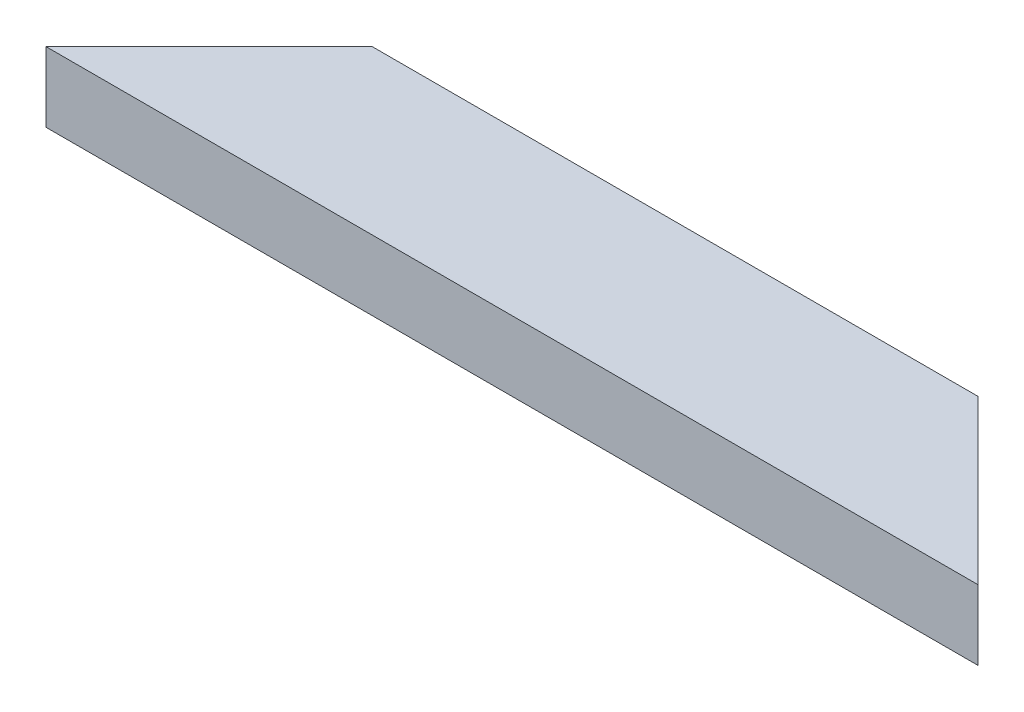
ISO-10303-21;
HEADER;
FILE_DESCRIPTION(('STEP AP214'),'2;1');
FILE_NAME('part.step','',(''),(''),'','','');
FILE_SCHEMA(('AUTOMOTIVE_DESIGN { 1 0 10303 214 1 1 1 1 }'));
ENDSEC;
DATA;
#1=APPLICATION_CONTEXT('core data for automotive mechanical design processes');
#2=APPLICATION_PROTOCOL_DEFINITION('international standard','automotive_design',2000,#1);
#3=PRODUCT_CONTEXT('',#1,'mechanical');
#4=PRODUCT('Part','Part','',(#3));
#5=PRODUCT_RELATED_PRODUCT_CATEGORY('part','',(#4));
#6=PRODUCT_DEFINITION_FORMATION('','',#4);
#7=PRODUCT_DEFINITION_CONTEXT('part definition',#1,'design');
#8=PRODUCT_DEFINITION('design','',#6,#7);
#9=PRODUCT_DEFINITION_SHAPE('','',#8);
#10=(LENGTH_UNIT() NAMED_UNIT(*) SI_UNIT(.MILLI.,.METRE.));
#11=(NAMED_UNIT(*) PLANE_ANGLE_UNIT() SI_UNIT($,.RADIAN.));
#12=(NAMED_UNIT(*) SI_UNIT($,.STERADIAN.) SOLID_ANGLE_UNIT());
#13=UNCERTAINTY_MEASURE_WITH_UNIT(LENGTH_MEASURE(1.E-05),#10,'distance_accuracy_value','');
#14=(GEOMETRIC_REPRESENTATION_CONTEXT(3) GLOBAL_UNCERTAINTY_ASSIGNED_CONTEXT((#13)) GLOBAL_UNIT_ASSIGNED_CONTEXT((#10,
#11,#12)) REPRESENTATION_CONTEXT('',''));
#15=CARTESIAN_POINT('',(0.,0.,0.));
#16=DIRECTION('',(0.,0.,1.));
#17=DIRECTION('',(1.,0.,0.));
#18=AXIS2_PLACEMENT_3D('',#15,#16,#17);
#19=CARTESIAN_POINT('',(0.,38.1,0.));
#20=DIRECTION('',(0.,0.,-1.));
#21=DIRECTION('',(-1.,0.,0.));
#22=AXIS2_PLACEMENT_3D('',#19,#20,#21);
#23=PLANE('',#22);
#24=DIRECTION('',(1.,0.,0.));
#25=VECTOR('',#24,1.);
#26=CARTESIAN_POINT('',(0.,0.,0.));
#27=LINE('',#26,#25);
#28=CARTESIAN_POINT('',(0.,0.,0.));
#29=VERTEX_POINT('',#28);
#30=CARTESIAN_POINT('',(508.,0.,0.));
#31=VERTEX_POINT('',#30);
#32=EDGE_CURVE('E98',#29,#31,#27,.T.);
#33=ORIENTED_EDGE('',*,*,#32,.T.);
#34=DIRECTION('',(0.,-1.,0.));
#35=VECTOR('',#34,1.);
#36=CARTESIAN_POINT('',(508.,38.1,0.));
#37=LINE('',#36,#35);
#38=CARTESIAN_POINT('',(508.,38.1,0.));
#39=VERTEX_POINT('',#38);
#40=EDGE_CURVE('E11',#39,#31,#37,.T.);
#41=ORIENTED_EDGE('',*,*,#40,.F.);
#42=DIRECTION('',(1.,0.,0.));
#43=VECTOR('',#42,1.);
#44=CARTESIAN_POINT('',(0.,38.1,0.));
#45=LINE('',#44,#43);
#46=CARTESIAN_POINT('',(0.,38.1,0.));
#47=VERTEX_POINT('',#46);
#48=EDGE_CURVE('E84',#47,#39,#45,.T.);
#49=ORIENTED_EDGE('',*,*,#48,.F.);
#50=DIRECTION('',(0.,-1.,0.));
#51=VECTOR('',#50,1.);
#52=CARTESIAN_POINT('',(0.,38.1,0.));
#53=LINE('',#52,#51);
#54=EDGE_CURVE('E51',#47,#29,#53,.T.);
#55=ORIENTED_EDGE('',*,*,#54,.T.);
#56=EDGE_LOOP('',(#33,#41,#49,#55));
#57=FACE_BOUND('',#56,.T.);
#58=ADVANCED_FACE('F35',(#57),#23,.F.);
#59=CARTESIAN_POINT('',(253.999999999999,38.1,-254.));
#60=DIRECTION('',(-0.707106781186546,0.,0.707106781186549));
#61=DIRECTION('',(0.707106781186549,0.,0.707106781186546));
#62=AXIS2_PLACEMENT_3D('',#59,#60,#61);
#63=PLANE('',#62);
#64=DIRECTION('',(-0.707106781186549,0.,-0.707106781186546));
#65=VECTOR('',#64,1.);
#66=CARTESIAN_POINT('',(253.999999999999,0.,-254.));
#67=LINE('',#66,#65);
#68=CARTESIAN_POINT('',(419.1,0.,-88.9));
#69=VERTEX_POINT('',#68);
#70=EDGE_CURVE('E89',#31,#69,#67,.T.);
#71=ORIENTED_EDGE('',*,*,#70,.T.);
#72=DIRECTION('',(0.,-1.,0.));
#73=VECTOR('',#72,1.);
#74=CARTESIAN_POINT('',(419.1,38.1,-88.9));
#75=LINE('',#74,#73);
#76=CARTESIAN_POINT('',(419.1,38.1,-88.9));
#77=VERTEX_POINT('',#76);
#78=EDGE_CURVE('E43',#77,#69,#75,.T.);
#79=ORIENTED_EDGE('',*,*,#78,.F.);
#80=DIRECTION('',(-0.707106781186549,0.,-0.707106781186546));
#81=VECTOR('',#80,1.);
#82=CARTESIAN_POINT('',(253.999999999999,38.1,-254.));
#83=LINE('',#82,#81);
#84=EDGE_CURVE('E76',#39,#77,#83,.T.);
#85=ORIENTED_EDGE('',*,*,#84,.F.);
#86=ORIENTED_EDGE('',*,*,#40,.T.);
#87=EDGE_LOOP('',(#71,#79,#85,#86));
#88=FACE_BOUND('',#87,.T.);
#89=ADVANCED_FACE('F88',(#88),#63,.F.);
#90=CARTESIAN_POINT('',(0.,38.1,-88.9));
#91=DIRECTION('',(0.,0.,-1.));
#92=DIRECTION('',(-1.,0.,0.));
#93=AXIS2_PLACEMENT_3D('',#90,#91,#92);
#94=PLANE('',#93);
#95=DIRECTION('',(1.,0.,0.));
#96=VECTOR('',#95,1.);
#97=CARTESIAN_POINT('',(0.,0.,-88.9));
#98=LINE('',#97,#96);
#99=CARTESIAN_POINT('',(88.9000000000003,0.,-88.9));
#100=VERTEX_POINT('',#99);
#101=EDGE_CURVE('E101',#100,#69,#98,.T.);
#102=ORIENTED_EDGE('',*,*,#101,.F.);
#103=DIRECTION('',(0.,-1.,0.));
#104=VECTOR('',#103,1.);
#105=CARTESIAN_POINT('',(88.9000000000003,38.1,-88.9));
#106=LINE('',#105,#104);
#107=CARTESIAN_POINT('',(88.9000000000003,38.1,-88.9));
#108=VERTEX_POINT('',#107);
#109=EDGE_CURVE('E65',#108,#100,#106,.T.);
#110=ORIENTED_EDGE('',*,*,#109,.F.);
#111=DIRECTION('',(1.,0.,0.));
#112=VECTOR('',#111,1.);
#113=CARTESIAN_POINT('',(0.,38.1,-88.9));
#114=LINE('',#113,#112);
#115=EDGE_CURVE('E83',#108,#77,#114,.T.);
#116=ORIENTED_EDGE('',*,*,#115,.T.);
#117=ORIENTED_EDGE('',*,*,#78,.T.);
#118=EDGE_LOOP('',(#102,#110,#116,#117));
#119=FACE_BOUND('',#118,.T.);
#120=ADVANCED_FACE('F92',(#119),#94,.T.);
#121=CARTESIAN_POINT('',(0.,38.1,0.));
#122=DIRECTION('',(-0.707106781186546,0.,-0.707106781186549));
#123=DIRECTION('',(-0.707106781186549,0.,0.707106781186546));
#124=AXIS2_PLACEMENT_3D('',#121,#122,#123);
#125=PLANE('',#124);
#126=DIRECTION('',(0.707106781186549,0.,-0.707106781186546));
#127=VECTOR('',#126,1.);
#128=CARTESIAN_POINT('',(0.,0.,0.));
#129=LINE('',#128,#127);
#130=EDGE_CURVE('E103',#29,#100,#129,.T.);
#131=ORIENTED_EDGE('',*,*,#130,.F.);
#132=ORIENTED_EDGE('',*,*,#54,.F.);
#133=DIRECTION('',(0.707106781186549,0.,-0.707106781186546));
#134=VECTOR('',#133,1.);
#135=CARTESIAN_POINT('',(0.,38.1,0.));
#136=LINE('',#135,#134);
#137=EDGE_CURVE('E93',#47,#108,#136,.T.);
#138=ORIENTED_EDGE('',*,*,#137,.T.);
#139=ORIENTED_EDGE('',*,*,#109,.T.);
#140=EDGE_LOOP('',(#131,#132,#138,#139));
#141=FACE_BOUND('',#140,.T.);
#142=ADVANCED_FACE('F109',(#141),#125,.T.);
#143=CARTESIAN_POINT('',(0.,38.1,0.));
#144=DIRECTION('',(0.,1.,0.));
#145=DIRECTION('',(0.,0.,1.));
#146=AXIS2_PLACEMENT_3D('',#143,#144,#145);
#147=PLANE('',#146);
#148=ORIENTED_EDGE('',*,*,#48,.T.);
#149=ORIENTED_EDGE('',*,*,#84,.T.);
#150=ORIENTED_EDGE('',*,*,#115,.F.);
#151=ORIENTED_EDGE('',*,*,#137,.F.);
#152=EDGE_LOOP('',(#148,#149,#150,#151));
#153=FACE_BOUND('',#152,.T.);
#154=ADVANCED_FACE('F80',(#153),#147,.T.);
#155=CARTESIAN_POINT('',(0.,0.,0.));
#156=DIRECTION('',(0.,1.,0.));
#157=DIRECTION('',(0.,0.,1.));
#158=AXIS2_PLACEMENT_3D('',#155,#156,#157);
#159=PLANE('',#158);
#160=ORIENTED_EDGE('',*,*,#32,.F.);
#161=ORIENTED_EDGE('',*,*,#130,.T.);
#162=ORIENTED_EDGE('',*,*,#101,.T.);
#163=ORIENTED_EDGE('',*,*,#70,.F.);
#164=EDGE_LOOP('',(#160,#161,#162,#163));
#165=FACE_BOUND('',#164,.T.);
#166=ADVANCED_FACE('F108',(#165),#159,.F.);
#167=CLOSED_SHELL('',(#58,#89,#120,#142,#154,#166));
#168=MANIFOLD_SOLID_BREP('B2',#167);
#169=ADVANCED_BREP_SHAPE_REPRESENTATION('',(#18,#168),#14);
#170=SHAPE_DEFINITION_REPRESENTATION(#9,#169);
ENDSEC;
END-ISO-10303-21;
